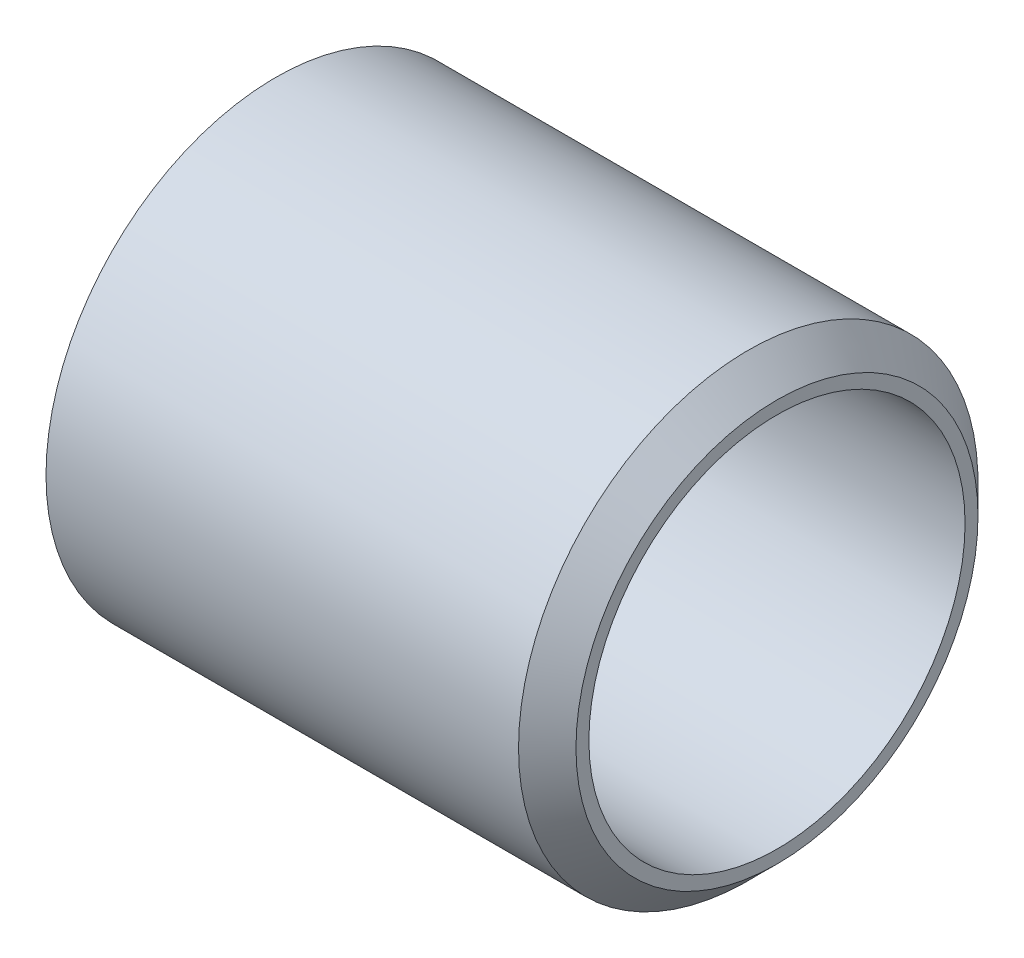
ISO-10303-21;
HEADER;
FILE_DESCRIPTION(('STEP AP214'),'2;1');
FILE_NAME('part.step','',(''),(''),'','','');
FILE_SCHEMA(('AUTOMOTIVE_DESIGN { 1 0 10303 214 1 1 1 1 }'));
ENDSEC;
DATA;
#1=APPLICATION_CONTEXT('core data for automotive mechanical design processes');
#2=APPLICATION_PROTOCOL_DEFINITION('international standard','automotive_design',2000,#1);
#3=PRODUCT_CONTEXT('',#1,'mechanical');
#4=PRODUCT('Part','Part','',(#3));
#5=PRODUCT_RELATED_PRODUCT_CATEGORY('part','',(#4));
#6=PRODUCT_DEFINITION_FORMATION('','',#4);
#7=PRODUCT_DEFINITION_CONTEXT('part definition',#1,'design');
#8=PRODUCT_DEFINITION('design','',#6,#7);
#9=PRODUCT_DEFINITION_SHAPE('','',#8);
#10=(LENGTH_UNIT() NAMED_UNIT(*) SI_UNIT(.MILLI.,.METRE.));
#11=(NAMED_UNIT(*) PLANE_ANGLE_UNIT() SI_UNIT($,.RADIAN.));
#12=(NAMED_UNIT(*) SI_UNIT($,.STERADIAN.) SOLID_ANGLE_UNIT());
#13=UNCERTAINTY_MEASURE_WITH_UNIT(LENGTH_MEASURE(1.E-05),#10,'distance_accuracy_value','');
#14=(GEOMETRIC_REPRESENTATION_CONTEXT(3) GLOBAL_UNCERTAINTY_ASSIGNED_CONTEXT((#13)) GLOBAL_UNIT_ASSIGNED_CONTEXT((#10,
#11,#12)) REPRESENTATION_CONTEXT('',''));
#15=CARTESIAN_POINT('',(0.,0.,0.));
#16=DIRECTION('',(0.,0.,1.));
#17=DIRECTION('',(1.,0.,0.));
#18=AXIS2_PLACEMENT_3D('',#15,#16,#17);
#19=CARTESIAN_POINT('',(0.,0.,0.));
#20=DIRECTION('',(-1.,0.,0.));
#21=DIRECTION('',(0.,0.,1.));
#22=AXIS2_PLACEMENT_3D('',#19,#20,#21);
#23=CYLINDRICAL_SURFACE('',#22,34.925);
#24=CARTESIAN_POINT('',(71.834375,0.,0.));
#25=DIRECTION('',(-1.,0.,0.));
#26=DIRECTION('',(0.,0.,1.));
#27=AXIS2_PLACEMENT_3D('',#24,#25,#26);
#28=CIRCLE('',#27,34.925);
#29=CARTESIAN_POINT('',(71.834375,0.,34.925));
#30=VERTEX_POINT('',#29);
#31=EDGE_CURVE('E52',#30,#30,#28,.T.);
#32=ORIENTED_EDGE('',*,*,#31,.T.);
#33=EDGE_LOOP('',(#32));
#34=FACE_BOUND('',#33,.T.);
#35=CARTESIAN_POINT('',(0.,0.,0.));
#36=DIRECTION('',(-1.,0.,0.));
#37=DIRECTION('',(0.,0.,1.));
#38=AXIS2_PLACEMENT_3D('',#35,#36,#37);
#39=CIRCLE('',#38,34.925);
#40=CARTESIAN_POINT('',(0.,0.,34.925));
#41=VERTEX_POINT('',#40);
#42=EDGE_CURVE('E10',#41,#41,#39,.T.);
#43=ORIENTED_EDGE('',*,*,#42,.F.);
#44=EDGE_LOOP('',(#43));
#45=FACE_BOUND('',#44,.T.);
#46=ADVANCED_FACE('F30',(#34,#45),#23,.T.);
#47=CARTESIAN_POINT('',(0.,31.76905,0.));
#48=DIRECTION('',(-1.,0.,0.));
#49=DIRECTION('',(0.,0.,1.));
#50=AXIS2_PLACEMENT_3D('',#47,#48,#49);
#51=PLANE('',#50);
#52=ORIENTED_EDGE('',*,*,#42,.T.);
#53=EDGE_LOOP('',(#52));
#54=FACE_BOUND('',#53,.T.);
#55=CARTESIAN_POINT('',(0.,0.,0.));
#56=DIRECTION('',(-1.,0.,0.));
#57=DIRECTION('',(0.,0.,1.));
#58=AXIS2_PLACEMENT_3D('',#55,#56,#57);
#59=CIRCLE('',#58,31.76905);
#60=CARTESIAN_POINT('',(0.,0.,31.76905));
#61=VERTEX_POINT('',#60);
#62=EDGE_CURVE('E36',#61,#61,#59,.T.);
#63=ORIENTED_EDGE('',*,*,#62,.F.);
#64=EDGE_LOOP('',(#63));
#65=FACE_BOUND('',#64,.T.);
#66=ADVANCED_FACE('F70',(#54,#65),#51,.T.);
#67=CARTESIAN_POINT('',(3.175,0.,0.));
#68=DIRECTION('',(-1.,0.,0.));
#69=DIRECTION('',(0.,0.,1.));
#70=AXIS2_PLACEMENT_3D('',#67,#68,#69);
#71=TOROIDAL_SURFACE('',#70,31.76905,3.175);
#72=CARTESIAN_POINT('',(3.175,0.,0.));
#73=DIRECTION('',(-1.,0.,0.));
#74=DIRECTION('',(0.,0.,1.));
#75=AXIS2_PLACEMENT_3D('',#72,#73,#74);
#76=CIRCLE('',#75,28.59405);
#77=CARTESIAN_POINT('',(3.175,0.,28.59405));
#78=VERTEX_POINT('',#77);
#79=EDGE_CURVE('E40',#78,#78,#76,.T.);
#80=ORIENTED_EDGE('',*,*,#79,.F.);
#81=EDGE_LOOP('',(#80));
#82=FACE_BOUND('',#81,.T.);
#83=ORIENTED_EDGE('',*,*,#62,.T.);
#84=EDGE_LOOP('',(#83));
#85=FACE_BOUND('',#84,.T.);
#86=ADVANCED_FACE('F74',(#82,#85),#71,.T.);
#87=CARTESIAN_POINT('',(0.,0.,0.));
#88=DIRECTION('',(-1.,0.,0.));
#89=DIRECTION('',(0.,0.,1.));
#90=AXIS2_PLACEMENT_3D('',#87,#88,#89);
#91=CYLINDRICAL_SURFACE('',#90,28.59405);
#92=ORIENTED_EDGE('',*,*,#79,.T.);
#93=EDGE_LOOP('',(#92));
#94=FACE_BOUND('',#93,.T.);
#95=CARTESIAN_POINT('',(76.2,0.,0.));
#96=DIRECTION('',(-1.,0.,0.));
#97=DIRECTION('',(0.,0.,1.));
#98=AXIS2_PLACEMENT_3D('',#95,#96,#97);
#99=CIRCLE('',#98,28.59405);
#100=CARTESIAN_POINT('',(76.2,0.,28.59405));
#101=VERTEX_POINT('',#100);
#102=EDGE_CURVE('E44',#101,#101,#99,.T.);
#103=ORIENTED_EDGE('',*,*,#102,.F.);
#104=EDGE_LOOP('',(#103));
#105=FACE_BOUND('',#104,.T.);
#106=ADVANCED_FACE('F66',(#94,#105),#91,.F.);
#107=CARTESIAN_POINT('',(76.2,30.559375,0.));
#108=DIRECTION('',(1.,0.,0.));
#109=DIRECTION('',(0.,0.,-1.));
#110=AXIS2_PLACEMENT_3D('',#107,#108,#109);
#111=PLANE('',#110);
#112=ORIENTED_EDGE('',*,*,#102,.T.);
#113=EDGE_LOOP('',(#112));
#114=FACE_BOUND('',#113,.T.);
#115=CARTESIAN_POINT('',(76.2,0.,0.));
#116=DIRECTION('',(-1.,0.,0.));
#117=DIRECTION('',(0.,0.,1.));
#118=AXIS2_PLACEMENT_3D('',#115,#116,#117);
#119=CIRCLE('',#118,30.559375);
#120=CARTESIAN_POINT('',(76.2,0.,30.559375));
#121=VERTEX_POINT('',#120);
#122=EDGE_CURVE('E49',#121,#121,#119,.T.);
#123=ORIENTED_EDGE('',*,*,#122,.F.);
#124=EDGE_LOOP('',(#123));
#125=FACE_BOUND('',#124,.T.);
#126=ADVANCED_FACE('F60',(#114,#125),#111,.T.);
#127=CARTESIAN_POINT('',(71.834375,0.,0.));
#128=DIRECTION('',(-1.,0.,0.));
#129=DIRECTION('',(0.,0.,1.));
#130=AXIS2_PLACEMENT_3D('',#127,#128,#129);
#131=CONICAL_SURFACE('',#130,34.925,0.785398163397445);
#132=ORIENTED_EDGE('',*,*,#122,.T.);
#133=EDGE_LOOP('',(#132));
#134=FACE_BOUND('',#133,.T.);
#135=ORIENTED_EDGE('',*,*,#31,.F.);
#136=EDGE_LOOP('',(#135));
#137=FACE_BOUND('',#136,.T.);
#138=ADVANCED_FACE('F58',(#134,#137),#131,.T.);
#139=CLOSED_SHELL('',(#46,#66,#86,#106,#126,#138));
#140=MANIFOLD_SOLID_BREP('B2',#139);
#141=ADVANCED_BREP_SHAPE_REPRESENTATION('',(#18,#140),#14);
#142=SHAPE_DEFINITION_REPRESENTATION(#9,#141);
ENDSEC;
END-ISO-10303-21;
